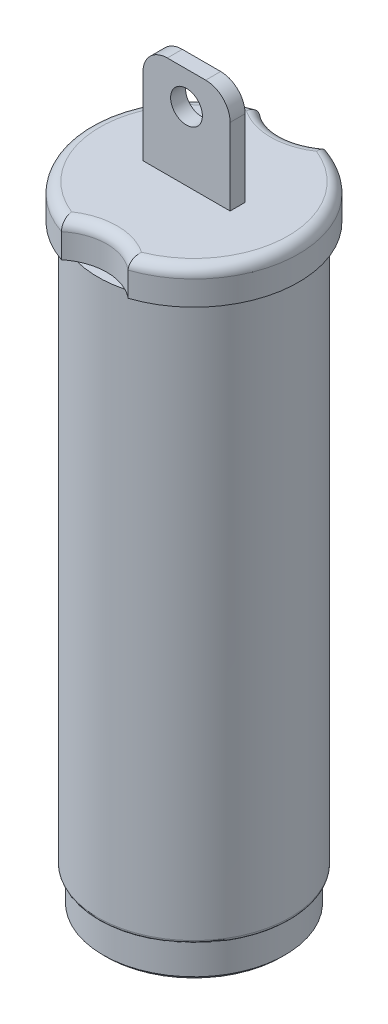
ISO-10303-21;
HEADER;
FILE_DESCRIPTION(('STEP AP214'),'2;1');
FILE_NAME('part.step','',(''),(''),'','','');
FILE_SCHEMA(('AUTOMOTIVE_DESIGN { 1 0 10303 214 1 1 1 1 }'));
ENDSEC;
DATA;
#1=APPLICATION_CONTEXT('core data for automotive mechanical design processes');
#2=APPLICATION_PROTOCOL_DEFINITION('international standard','automotive_design',2000,#1);
#3=PRODUCT_CONTEXT('',#1,'mechanical');
#4=PRODUCT('Part','Part','',(#3));
#5=PRODUCT_RELATED_PRODUCT_CATEGORY('part','',(#4));
#6=PRODUCT_DEFINITION_FORMATION('','',#4);
#7=PRODUCT_DEFINITION_CONTEXT('part definition',#1,'design');
#8=PRODUCT_DEFINITION('design','',#6,#7);
#9=PRODUCT_DEFINITION_SHAPE('','',#8);
#10=(LENGTH_UNIT() NAMED_UNIT(*) SI_UNIT(.MILLI.,.METRE.));
#11=(NAMED_UNIT(*) PLANE_ANGLE_UNIT() SI_UNIT($,.RADIAN.));
#12=(NAMED_UNIT(*) SI_UNIT($,.STERADIAN.) SOLID_ANGLE_UNIT());
#13=UNCERTAINTY_MEASURE_WITH_UNIT(LENGTH_MEASURE(1.E-05),#10,'distance_accuracy_value','');
#14=(GEOMETRIC_REPRESENTATION_CONTEXT(3) GLOBAL_UNCERTAINTY_ASSIGNED_CONTEXT((#13)) GLOBAL_UNIT_ASSIGNED_CONTEXT((#10,
#11,#12)) REPRESENTATION_CONTEXT('',''));
#15=CARTESIAN_POINT('',(0.,0.,0.));
#16=DIRECTION('',(0.,0.,1.));
#17=DIRECTION('',(1.,0.,0.));
#18=AXIS2_PLACEMENT_3D('',#15,#16,#17);
#19=CARTESIAN_POINT('',(0.,17.,0.));
#20=DIRECTION('',(0.,1.,0.));
#21=DIRECTION('',(0.,0.,1.));
#22=AXIS2_PLACEMENT_3D('',#19,#20,#21);
#23=PLANE('',#22);
#24=CARTESIAN_POINT('',(0.,17.,0.));
#25=DIRECTION('',(0.,1.,0.));
#26=DIRECTION('',(0.,0.,1.));
#27=AXIS2_PLACEMENT_3D('',#24,#25,#26);
#28=CIRCLE('',#27,2.7);
#29=CARTESIAN_POINT('',(-1.00434602478429,17.,-2.50625));
#30=VERTEX_POINT('',#29);
#31=CARTESIAN_POINT('',(-1.00434602478429,17.,2.50625));
#32=VERTEX_POINT('',#31);
#33=EDGE_CURVE('E271',#30,#32,#28,.T.);
#34=ORIENTED_EDGE('',*,*,#33,.T.);
#35=CARTESIAN_POINT('',(0.,17.,4.));
#36=DIRECTION('',(0.,1.,0.));
#37=DIRECTION('',(0.,0.,1.));
#38=AXIS2_PLACEMENT_3D('',#35,#36,#37);
#39=CIRCLE('',#38,1.8);
#40=CARTESIAN_POINT('',(1.00434602478429,17.,2.50625));
#41=VERTEX_POINT('',#40);
#42=EDGE_CURVE('E273',#32,#41,#39,.F.);
#43=ORIENTED_EDGE('',*,*,#42,.T.);
#44=CARTESIAN_POINT('',(0.,17.,0.));
#45=DIRECTION('',(0.,1.,0.));
#46=DIRECTION('',(0.,0.,1.));
#47=AXIS2_PLACEMENT_3D('',#44,#45,#46);
#48=CIRCLE('',#47,2.7);
#49=CARTESIAN_POINT('',(1.00434602478429,17.,-2.50625));
#50=VERTEX_POINT('',#49);
#51=EDGE_CURVE('E267',#41,#50,#48,.T.);
#52=ORIENTED_EDGE('',*,*,#51,.T.);
#53=CARTESIAN_POINT('',(0.,17.,-4.));
#54=DIRECTION('',(0.,1.,0.));
#55=DIRECTION('',(0.,0.,1.));
#56=AXIS2_PLACEMENT_3D('',#53,#54,#55);
#57=CIRCLE('',#56,1.8);
#58=EDGE_CURVE('E269',#50,#30,#57,.F.);
#59=ORIENTED_EDGE('',*,*,#58,.T.);
#60=EDGE_LOOP('',(#34,#43,#52,#59));
#61=FACE_BOUND('',#60,.T.);
#62=DIRECTION('',(1.,0.,0.));
#63=VECTOR('',#62,1.);
#64=CARTESIAN_POINT('',(1.25,17.,0.214689537244794));
#65=LINE('',#64,#63);
#66=CARTESIAN_POINT('',(-1.25,17.,0.214689537244794));
#67=VERTEX_POINT('',#66);
#68=CARTESIAN_POINT('',(1.25,17.,0.214689537244794));
#69=VERTEX_POINT('',#68);
#70=EDGE_CURVE('E146',#67,#69,#65,.T.);
#71=ORIENTED_EDGE('',*,*,#70,.F.);
#72=DIRECTION('',(0.,0.,1.));
#73=VECTOR('',#72,1.);
#74=CARTESIAN_POINT('',(-1.25,17.,0.214689537244794));
#75=LINE('',#74,#73);
#76=CARTESIAN_POINT('',(-1.25,17.,-0.214689537244794));
#77=VERTEX_POINT('',#76);
#78=EDGE_CURVE('E153',#77,#67,#75,.T.);
#79=ORIENTED_EDGE('',*,*,#78,.F.);
#80=DIRECTION('',(-1.,0.,0.));
#81=VECTOR('',#80,1.);
#82=CARTESIAN_POINT('',(1.25,17.,-0.214689537244795));
#83=LINE('',#82,#81);
#84=CARTESIAN_POINT('',(1.25,17.,-0.214689537244795));
#85=VERTEX_POINT('',#84);
#86=EDGE_CURVE('E164',#85,#77,#83,.T.);
#87=ORIENTED_EDGE('',*,*,#86,.F.);
#88=DIRECTION('',(0.,0.,-1.));
#89=VECTOR('',#88,1.);
#90=CARTESIAN_POINT('',(1.25,17.,0.214689537244794));
#91=LINE('',#90,#89);
#92=EDGE_CURVE('E162',#69,#85,#91,.T.);
#93=ORIENTED_EDGE('',*,*,#92,.F.);
#94=EDGE_LOOP('',(#71,#79,#87,#93));
#95=FACE_BOUND('',#94,.T.);
#96=ADVANCED_FACE('F39',(#61,#95),#23,.T.);
#97=CARTESIAN_POINT('',(0.,16.,0.));
#98=DIRECTION('',(0.,1.,0.));
#99=DIRECTION('',(0.,0.,1.));
#100=AXIS2_PLACEMENT_3D('',#97,#98,#99);
#101=PLANE('',#100);
#102=CARTESIAN_POINT('',(0.,16.,0.));
#103=DIRECTION('',(0.,1.,0.));
#104=DIRECTION('',(0.,0.,1.));
#105=AXIS2_PLACEMENT_3D('',#102,#103,#104);
#106=CIRCLE('',#105,2.75);
#107=CARTESIAN_POINT('',(0.68210775988384,16.,-2.6640625));
#108=VERTEX_POINT('',#107);
#109=CARTESIAN_POINT('',(-0.68210775988384,16.,-2.6640625));
#110=VERTEX_POINT('',#109);
#111=EDGE_CURVE('E463',#108,#110,#106,.T.);
#112=ORIENTED_EDGE('',*,*,#111,.T.);
#113=CARTESIAN_POINT('',(0.,16.,-4.));
#114=DIRECTION('',(0.,1.,0.));
#115=DIRECTION('',(0.,0.,1.));
#116=AXIS2_PLACEMENT_3D('',#113,#114,#115);
#117=CIRCLE('',#116,1.5);
#118=EDGE_CURVE('E184',#110,#108,#117,.T.);
#119=ORIENTED_EDGE('',*,*,#118,.T.);
#120=EDGE_LOOP('',(#112,#119));
#121=FACE_BOUND('',#120,.T.);
#122=ADVANCED_FACE('F339',(#121),#101,.T.);
#123=CARTESIAN_POINT('',(0.,16.,4.));
#124=DIRECTION('',(0.,1.,0.));
#125=DIRECTION('',(0.,0.,1.));
#126=AXIS2_PLACEMENT_3D('',#123,#124,#125);
#127=CIRCLE('',#126,1.5);
#128=CARTESIAN_POINT('',(-0.68210775988384,16.,2.6640625));
#129=VERTEX_POINT('',#128);
#130=CARTESIAN_POINT('',(0.68210775988384,16.,2.6640625));
#131=VERTEX_POINT('',#130);
#132=EDGE_CURVE('E192',#129,#131,#127,.F.);
#133=ORIENTED_EDGE('',*,*,#132,.F.);
#134=EDGE_CURVE('E461',#129,#131,#106,.T.);
#135=ORIENTED_EDGE('',*,*,#134,.T.);
#136=EDGE_LOOP('',(#133,#135));
#137=FACE_BOUND('',#136,.T.);
#138=ADVANCED_FACE('F244',(#137),#101,.T.);
#139=CARTESIAN_POINT('',(0.,0.,0.));
#140=DIRECTION('',(0.,1.,0.));
#141=DIRECTION('',(0.,0.,1.));
#142=AXIS2_PLACEMENT_3D('',#139,#140,#141);
#143=PLANE('',#142);
#144=CARTESIAN_POINT('',(0.,0.,0.));
#145=DIRECTION('',(0.,1.,0.));
#146=DIRECTION('',(0.,0.,1.));
#147=AXIS2_PLACEMENT_3D('',#144,#145,#146);
#148=CIRCLE('',#147,2.65);
#149=CARTESIAN_POINT('',(0.,0.,2.65));
#150=VERTEX_POINT('',#149);
#151=EDGE_CURVE('E11',#150,#150,#148,.F.);
#152=ORIENTED_EDGE('',*,*,#151,.T.);
#153=EDGE_LOOP('',(#152));
#154=FACE_BOUND('',#153,.T.);
#155=CARTESIAN_POINT('',(0.,0.,0.));
#156=DIRECTION('',(0.,-1.,0.));
#157=DIRECTION('',(0.,0.,-1.));
#158=AXIS2_PLACEMENT_3D('',#155,#156,#157);
#159=CIRCLE('',#158,2.60763051780912);
#160=CARTESIAN_POINT('',(0.,0.,-2.60763051780912));
#161=VERTEX_POINT('',#160);
#162=EDGE_CURVE('E201',#161,#161,#159,.T.);
#163=ORIENTED_EDGE('',*,*,#162,.F.);
#164=EDGE_LOOP('',(#163));
#165=FACE_BOUND('',#164,.T.);
#166=ADVANCED_FACE('F453',(#154,#165),#143,.F.);
#167=CARTESIAN_POINT('',(0.,16.,0.));
#168=DIRECTION('',(0.,-1.,0.));
#169=DIRECTION('',(0.,0.,-1.));
#170=AXIS2_PLACEMENT_3D('',#167,#168,#169);
#171=CYLINDRICAL_SURFACE('',#170,2.75);
#172=CARTESIAN_POINT('',(0.,0.0999999999999994,0.));
#173=DIRECTION('',(0.,1.,0.));
#174=DIRECTION('',(0.,0.,1.));
#175=AXIS2_PLACEMENT_3D('',#172,#173,#174);
#176=CIRCLE('',#175,2.75);
#177=CARTESIAN_POINT('',(0.,0.0999999999999994,2.75));
#178=VERTEX_POINT('',#177);
#179=EDGE_CURVE('E47',#178,#178,#176,.T.);
#180=ORIENTED_EDGE('',*,*,#179,.T.);
#181=EDGE_LOOP('',(#180));
#182=FACE_BOUND('',#181,.T.);
#183=EDGE_CURVE('E205',#131,#108,#106,.T.);
#184=ORIENTED_EDGE('',*,*,#183,.F.);
#185=ORIENTED_EDGE('',*,*,#134,.F.);
#186=EDGE_CURVE('E467',#110,#129,#106,.T.);
#187=ORIENTED_EDGE('',*,*,#186,.F.);
#188=ORIENTED_EDGE('',*,*,#111,.F.);
#189=EDGE_LOOP('',(#184,#185,#187,#188));
#190=FACE_BOUND('',#189,.T.);
#191=ADVANCED_FACE('F242',(#182,#190),#171,.T.);
#192=CARTESIAN_POINT('',(0.,16.,0.));
#193=DIRECTION('',(0.,-1.,0.));
#194=DIRECTION('',(0.,0.,-1.));
#195=AXIS2_PLACEMENT_3D('',#192,#193,#194);
#196=CYLINDRICAL_SURFACE('',#195,1.05);
#197=CARTESIAN_POINT('',(0.,16.,0.));
#198=DIRECTION('',(0.,1.,0.));
#199=DIRECTION('',(0.,0.,1.));
#200=AXIS2_PLACEMENT_3D('',#197,#198,#199);
#201=CIRCLE('',#200,1.05);
#202=CARTESIAN_POINT('',(0.,16.,1.05));
#203=VERTEX_POINT('',#202);
#204=EDGE_CURVE('E200',#203,#203,#201,.T.);
#205=ORIENTED_EDGE('',*,*,#204,.T.);
#206=EDGE_LOOP('',(#205));
#207=FACE_BOUND('',#206,.T.);
#208=CARTESIAN_POINT('',(0.,0.,0.));
#209=DIRECTION('',(0.,1.,0.));
#210=DIRECTION('',(0.,0.,-1.));
#211=AXIS2_PLACEMENT_3D('',#208,#209,#210);
#212=CIRCLE('',#211,1.045);
#213=CARTESIAN_POINT('',(0.,0.,-1.045));
#214=VERTEX_POINT('',#213);
#215=EDGE_CURVE('E210',#214,#214,#212,.T.);
#216=ORIENTED_EDGE('',*,*,#215,.F.);
#217=EDGE_LOOP('',(#216));
#218=FACE_BOUND('',#217,.T.);
#219=ADVANCED_FACE('F234',(#207,#218),#196,.F.);
#220=CARTESIAN_POINT('',(0.,-1.,0.));
#221=DIRECTION('',(0.,-1.,0.));
#222=DIRECTION('',(0.,0.,-1.));
#223=AXIS2_PLACEMENT_3D('',#220,#221,#222);
#224=PLANE('',#223);
#225=CARTESIAN_POINT('',(0.,-1.,0.));
#226=DIRECTION('',(0.,-1.,0.));
#227=DIRECTION('',(0.,0.,-1.));
#228=AXIS2_PLACEMENT_3D('',#225,#226,#227);
#229=CIRCLE('',#228,2.50763051780912);
#230=CARTESIAN_POINT('',(0.,-1.,-2.50763051780912));
#231=VERTEX_POINT('',#230);
#232=EDGE_CURVE('E261',#231,#231,#229,.T.);
#233=ORIENTED_EDGE('',*,*,#232,.T.);
#234=EDGE_LOOP('',(#233));
#235=FACE_BOUND('',#234,.T.);
#236=CARTESIAN_POINT('',(0.,-1.,0.));
#237=DIRECTION('',(0.,-1.,0.));
#238=DIRECTION('',(0.,0.,-1.));
#239=AXIS2_PLACEMENT_3D('',#236,#237,#238);
#240=CIRCLE('',#239,1.845);
#241=CARTESIAN_POINT('',(0.,-1.,-1.845));
#242=VERTEX_POINT('',#241);
#243=EDGE_CURVE('E258',#242,#242,#240,.F.);
#244=ORIENTED_EDGE('',*,*,#243,.T.);
#245=EDGE_LOOP('',(#244));
#246=FACE_BOUND('',#245,.T.);
#247=ADVANCED_FACE('F231',(#235,#246),#224,.T.);
#248=CARTESIAN_POINT('',(0.,-1.,0.));
#249=DIRECTION('',(0.,1.,0.));
#250=DIRECTION('',(0.,0.,1.));
#251=AXIS2_PLACEMENT_3D('',#248,#249,#250);
#252=CYLINDRICAL_SURFACE('',#251,2.60763051780912);
#253=CARTESIAN_POINT('',(0.,-0.899999999999997,0.));
#254=DIRECTION('',(0.,-1.,0.));
#255=DIRECTION('',(0.,0.,-1.));
#256=AXIS2_PLACEMENT_3D('',#253,#254,#255);
#257=CIRCLE('',#256,2.60763051780912);
#258=CARTESIAN_POINT('',(0.,-0.899999999999997,-2.60763051780912));
#259=VERTEX_POINT('',#258);
#260=EDGE_CURVE('E264',#259,#259,#257,.F.);
#261=ORIENTED_EDGE('',*,*,#260,.T.);
#262=EDGE_LOOP('',(#261));
#263=FACE_BOUND('',#262,.T.);
#264=ORIENTED_EDGE('',*,*,#162,.T.);
#265=EDGE_LOOP('',(#264));
#266=FACE_BOUND('',#265,.T.);
#267=ADVANCED_FACE('F227',(#263,#266),#252,.T.);
#268=CARTESIAN_POINT('',(0.,-1.,0.));
#269=DIRECTION('',(0.,1.,0.));
#270=DIRECTION('',(0.,0.,1.));
#271=AXIS2_PLACEMENT_3D('',#268,#269,#270);
#272=CYLINDRICAL_SURFACE('',#271,1.045);
#273=CARTESIAN_POINT('',(0.,-0.199999999999999,0.));
#274=DIRECTION('',(0.,-1.,0.));
#275=DIRECTION('',(0.,0.,-1.));
#276=AXIS2_PLACEMENT_3D('',#273,#274,#275);
#277=CIRCLE('',#276,1.045);
#278=CARTESIAN_POINT('',(0.,-0.199999999999999,-1.045));
#279=VERTEX_POINT('',#278);
#280=EDGE_CURVE('E204',#279,#279,#277,.T.);
#281=ORIENTED_EDGE('',*,*,#280,.T.);
#282=EDGE_LOOP('',(#281));
#283=FACE_BOUND('',#282,.T.);
#284=ORIENTED_EDGE('',*,*,#215,.T.);
#285=EDGE_LOOP('',(#284));
#286=FACE_BOUND('',#285,.T.);
#287=ADVANCED_FACE('F216',(#283,#286),#272,.F.);
#288=CARTESIAN_POINT('',(0.,-0.199999999999999,0.));
#289=DIRECTION('',(0.,-1.,0.));
#290=DIRECTION('',(0.,0.,-1.));
#291=AXIS2_PLACEMENT_3D('',#288,#289,#290);
#292=CONICAL_SURFACE('',#291,1.045,0.78539816339745);
#293=ORIENTED_EDGE('',*,*,#243,.F.);
#294=EDGE_LOOP('',(#293));
#295=FACE_BOUND('',#294,.T.);
#296=ORIENTED_EDGE('',*,*,#280,.F.);
#297=EDGE_LOOP('',(#296));
#298=FACE_BOUND('',#297,.T.);
#299=ADVANCED_FACE('F226',(#295,#298),#292,.F.);
#300=CARTESIAN_POINT('',(0.,-1.,0.));
#301=DIRECTION('',(0.,1.,0.));
#302=DIRECTION('',(0.,0.,1.));
#303=AXIS2_PLACEMENT_3D('',#300,#301,#302);
#304=CONICAL_SURFACE('',#303,2.50763051780912,0.78539816339744);
#305=ORIENTED_EDGE('',*,*,#260,.F.);
#306=EDGE_LOOP('',(#305));
#307=FACE_BOUND('',#306,.T.);
#308=ORIENTED_EDGE('',*,*,#232,.F.);
#309=EDGE_LOOP('',(#308));
#310=FACE_BOUND('',#309,.T.);
#311=ADVANCED_FACE('F358',(#307,#310),#304,.T.);
#312=CARTESIAN_POINT('',(0.,17.,4.));
#313=DIRECTION('',(0.,-1.,0.));
#314=DIRECTION('',(0.,0.,-1.));
#315=AXIS2_PLACEMENT_3D('',#312,#313,#314);
#316=CYLINDRICAL_SURFACE('',#315,1.5);
#317=DIRECTION('',(0.,-1.,0.));
#318=VECTOR('',#317,1.);
#319=CARTESIAN_POINT('',(0.955555303213792,17.,2.84375));
#320=LINE('',#319,#318);
#321=CARTESIAN_POINT('',(0.955555303213792,16.7,2.84375));
#322=VERTEX_POINT('',#321);
#323=CARTESIAN_POINT('',(0.955555303213792,16.,2.84375));
#324=VERTEX_POINT('',#323);
#325=EDGE_CURVE('E191',#322,#324,#320,.T.);
#326=ORIENTED_EDGE('',*,*,#325,.F.);
#327=CARTESIAN_POINT('',(0.,16.7,4.));
#328=DIRECTION('',(0.,1.,0.));
#329=DIRECTION('',(0.,0.,1.));
#330=AXIS2_PLACEMENT_3D('',#327,#328,#329);
#331=CIRCLE('',#330,1.5);
#332=CARTESIAN_POINT('',(-0.955555303213792,16.7,2.84375));
#333=VERTEX_POINT('',#332);
#334=EDGE_CURVE('E276',#322,#333,#331,.T.);
#335=ORIENTED_EDGE('',*,*,#334,.T.);
#336=DIRECTION('',(0.,-1.,0.));
#337=VECTOR('',#336,1.);
#338=CARTESIAN_POINT('',(-0.955555303213792,17.,2.84375));
#339=LINE('',#338,#337);
#340=CARTESIAN_POINT('',(-0.955555303213792,16.,2.84375));
#341=VERTEX_POINT('',#340);
#342=EDGE_CURVE('E194',#333,#341,#339,.T.);
#343=ORIENTED_EDGE('',*,*,#342,.T.);
#344=EDGE_CURVE('E188',#341,#129,#127,.F.);
#345=ORIENTED_EDGE('',*,*,#344,.T.);
#346=ORIENTED_EDGE('',*,*,#132,.T.);
#347=EDGE_CURVE('E187',#131,#324,#127,.F.);
#348=ORIENTED_EDGE('',*,*,#347,.T.);
#349=EDGE_LOOP('',(#326,#335,#343,#345,#346,#348));
#350=FACE_BOUND('',#349,.T.);
#351=ADVANCED_FACE('F354',(#350),#316,.F.);
#352=CARTESIAN_POINT('',(0.,17.,0.));
#353=DIRECTION('',(0.,-1.,0.));
#354=DIRECTION('',(0.,0.,-1.));
#355=AXIS2_PLACEMENT_3D('',#352,#353,#354);
#356=CYLINDRICAL_SURFACE('',#355,3.);
#357=ORIENTED_EDGE('',*,*,#342,.F.);
#358=CARTESIAN_POINT('',(0.,16.7,0.));
#359=DIRECTION('',(0.,1.,0.));
#360=DIRECTION('',(0.,0.,1.));
#361=AXIS2_PLACEMENT_3D('',#358,#359,#360);
#362=CIRCLE('',#361,3.);
#363=CARTESIAN_POINT('',(-0.955555303213792,16.7,-2.84375));
#364=VERTEX_POINT('',#363);
#365=EDGE_CURVE('E279',#333,#364,#362,.F.);
#366=ORIENTED_EDGE('',*,*,#365,.T.);
#367=DIRECTION('',(0.,-1.,0.));
#368=VECTOR('',#367,1.);
#369=CARTESIAN_POINT('',(-0.955555303213792,17.,-2.84375));
#370=LINE('',#369,#368);
#371=CARTESIAN_POINT('',(-0.955555303213792,16.,-2.84375));
#372=VERTEX_POINT('',#371);
#373=EDGE_CURVE('E196',#364,#372,#370,.T.);
#374=ORIENTED_EDGE('',*,*,#373,.T.);
#375=CARTESIAN_POINT('',(0.,16.,0.));
#376=DIRECTION('',(0.,1.,0.));
#377=DIRECTION('',(0.,0.,1.));
#378=AXIS2_PLACEMENT_3D('',#375,#376,#377);
#379=CIRCLE('',#378,3.);
#380=EDGE_CURVE('E183',#372,#341,#379,.T.);
#381=ORIENTED_EDGE('',*,*,#380,.T.);
#382=EDGE_LOOP('',(#357,#366,#374,#381));
#383=FACE_BOUND('',#382,.T.);
#384=ADVANCED_FACE('F357',(#383),#356,.T.);
#385=CARTESIAN_POINT('',(0.,17.,-4.));
#386=DIRECTION('',(0.,-1.,0.));
#387=DIRECTION('',(0.,0.,-1.));
#388=AXIS2_PLACEMENT_3D('',#385,#386,#387);
#389=CYLINDRICAL_SURFACE('',#388,1.5);
#390=ORIENTED_EDGE('',*,*,#373,.F.);
#391=CARTESIAN_POINT('',(0.,16.7,-4.));
#392=DIRECTION('',(0.,1.,0.));
#393=DIRECTION('',(0.,0.,1.));
#394=AXIS2_PLACEMENT_3D('',#391,#392,#393);
#395=CIRCLE('',#394,1.5);
#396=CARTESIAN_POINT('',(0.955555303213792,16.7,-2.84375));
#397=VERTEX_POINT('',#396);
#398=EDGE_CURVE('E281',#364,#397,#395,.T.);
#399=ORIENTED_EDGE('',*,*,#398,.T.);
#400=DIRECTION('',(0.,-1.,0.));
#401=VECTOR('',#400,1.);
#402=CARTESIAN_POINT('',(0.955555303213792,17.,-2.84375));
#403=LINE('',#402,#401);
#404=CARTESIAN_POINT('',(0.955555303213792,16.,-2.84375));
#405=VERTEX_POINT('',#404);
#406=EDGE_CURVE('E198',#397,#405,#403,.T.);
#407=ORIENTED_EDGE('',*,*,#406,.T.);
#408=EDGE_CURVE('E178',#108,#405,#117,.T.);
#409=ORIENTED_EDGE('',*,*,#408,.F.);
#410=ORIENTED_EDGE('',*,*,#118,.F.);
#411=EDGE_CURVE('E180',#372,#110,#117,.T.);
#412=ORIENTED_EDGE('',*,*,#411,.F.);
#413=EDGE_LOOP('',(#390,#399,#407,#409,#410,#412));
#414=FACE_BOUND('',#413,.T.);
#415=ADVANCED_FACE('F361',(#414),#389,.F.);
#416=CARTESIAN_POINT('',(0.,17.,0.));
#417=DIRECTION('',(0.,-1.,0.));
#418=DIRECTION('',(0.,0.,-1.));
#419=AXIS2_PLACEMENT_3D('',#416,#417,#418);
#420=CYLINDRICAL_SURFACE('',#419,3.);
#421=ORIENTED_EDGE('',*,*,#406,.F.);
#422=CARTESIAN_POINT('',(0.,16.7,0.));
#423=DIRECTION('',(0.,1.,0.));
#424=DIRECTION('',(0.,0.,1.));
#425=AXIS2_PLACEMENT_3D('',#422,#423,#424);
#426=CIRCLE('',#425,3.);
#427=EDGE_CURVE('E283',#397,#322,#426,.F.);
#428=ORIENTED_EDGE('',*,*,#427,.T.);
#429=ORIENTED_EDGE('',*,*,#325,.T.);
#430=CARTESIAN_POINT('',(0.,16.,0.));
#431=DIRECTION('',(0.,1.,0.));
#432=DIRECTION('',(0.,0.,1.));
#433=AXIS2_PLACEMENT_3D('',#430,#431,#432);
#434=CIRCLE('',#433,3.);
#435=EDGE_CURVE('E175',#324,#405,#434,.T.);
#436=ORIENTED_EDGE('',*,*,#435,.T.);
#437=EDGE_LOOP('',(#421,#428,#429,#436));
#438=FACE_BOUND('',#437,.T.);
#439=ADVANCED_FACE('F229',(#438),#420,.T.);
#440=CARTESIAN_POINT('',(0.,16.,0.));
#441=DIRECTION('',(0.,1.,0.));
#442=DIRECTION('',(0.,0.,1.));
#443=AXIS2_PLACEMENT_3D('',#440,#441,#442);
#444=PLANE('',#443);
#445=ORIENTED_EDGE('',*,*,#411,.T.);
#446=ORIENTED_EDGE('',*,*,#186,.T.);
#447=ORIENTED_EDGE('',*,*,#344,.F.);
#448=ORIENTED_EDGE('',*,*,#380,.F.);
#449=EDGE_LOOP('',(#445,#446,#447,#448));
#450=FACE_BOUND('',#449,.T.);
#451=ADVANCED_FACE('F353',(#450),#444,.F.);
#452=ORIENTED_EDGE('',*,*,#347,.F.);
#453=ORIENTED_EDGE('',*,*,#183,.T.);
#454=ORIENTED_EDGE('',*,*,#408,.T.);
#455=ORIENTED_EDGE('',*,*,#435,.F.);
#456=EDGE_LOOP('',(#452,#453,#454,#455));
#457=FACE_BOUND('',#456,.T.);
#458=ADVANCED_FACE('F351',(#457),#444,.F.);
#459=ORIENTED_EDGE('',*,*,#204,.F.);
#460=EDGE_LOOP('',(#459));
#461=FACE_BOUND('',#460,.T.);
#462=ADVANCED_FACE('F323',(#461),#444,.F.);
#463=CARTESIAN_POINT('',(0.,16.7,-4.));
#464=DIRECTION('',(0.,1.,0.));
#465=DIRECTION('',(0.,0.,1.));
#466=AXIS2_PLACEMENT_3D('',#463,#464,#465);
#467=TOROIDAL_SURFACE('',#466,1.8,0.3);
#468=CARTESIAN_POINT('',(0.955555303213792,16.7,-2.84375));
#469=CARTESIAN_POINT('',(0.955548701487983,16.715384339661,-2.84377207727176));
#470=CARTESIAN_POINT('',(0.95580174054099,16.730751513169,-2.84242028339868));
#471=CARTESIAN_POINT('',(0.956774776183254,16.7609597229585,-2.83714787720674));
#472=CARTESIAN_POINT('',(0.957492811320862,16.7758026943546,-2.83323805448418));
#473=CARTESIAN_POINT('',(0.959343535658604,16.8045947766047,-2.82303011059292));
#474=CARTESIAN_POINT('',(0.960475878296952,16.8185446231176,-2.81673398537173));
#475=CARTESIAN_POINT('',(0.963073607038979,16.8452523125629,-2.8020263924885));
#476=CARTESIAN_POINT('',(0.964539259371533,16.8580091910625,-2.79361323328459));
#477=CARTESIAN_POINT('',(0.96779448281328,16.8826943382473,-2.77450655708168));
#478=CARTESIAN_POINT('',(0.969596689853157,16.8945480383382,-2.76371920903136));
#479=CARTESIAN_POINT('',(0.973368124994136,16.9164889011527,-2.74050828464685));
#480=CARTESIAN_POINT('',(0.975337400111097,16.9265755641372,-2.72808424717244));
#481=CARTESIAN_POINT('',(0.979590034044766,16.9459564541,-2.70038676711626));
#482=CARTESIAN_POINT('',(0.981882962794164,16.9550152228182,-2.68495012894321));
#483=CARTESIAN_POINT('',(0.986458193334012,16.9706987304564,-2.65287691843595));
#484=CARTESIAN_POINT('',(0.988740484500178,16.9773214049212,-2.63623934258911));
#485=CARTESIAN_POINT('',(0.993286535694899,16.9882657945014,-2.60157388148209));
#486=CARTESIAN_POINT('',(0.995546845241936,16.9924987689439,-2.58351770874323));
#487=CARTESIAN_POINT('',(0.999890275795183,16.9982613247151,-2.54698677070024));
#488=CARTESIAN_POINT('',(1.00197375919003,16.9997965686764,-2.5285129648368));
#489=CARTESIAN_POINT('',(1.00407829330572,16.9999937106008,-2.50877584257417));
#490=CARTESIAN_POINT('',(1.00421242895935,17.000000012848,-2.50751288583825));
#491=CARTESIAN_POINT('',(1.00434602478429,17.,-2.50625));
#492=B_SPLINE_CURVE_WITH_KNOTS('',3,(#468,#469,#470,#471,#472,#473,#474,#475,#476,#477,#478,
#479,#480,#481,#482,#483,#484,#485,#486,#487,#488,#489,#490,#491),.UNSPECIFIED.,.F.,.F.,(4,2,2,
2,2,2,2,2,2,2,2,4),(0.,0.0460647228614722,0.0919363896364907,0.137769772872144,
0.183639894602704,0.231830584299086,0.280034880966539,0.333950101679263,0.387910907871495,
0.443762183138881,0.49949608391235,0.503306237325868),.UNSPECIFIED.);
#493=EDGE_CURVE('E309',#397,#50,#492,.T.);
#494=ORIENTED_EDGE('',*,*,#493,.F.);
#495=ORIENTED_EDGE('',*,*,#398,.F.);
#496=CARTESIAN_POINT('',(-0.955555303213792,16.7,-2.84375));
#497=CARTESIAN_POINT('',(-0.955548701487983,16.715384339661,-2.84377207727176));
#498=CARTESIAN_POINT('',(-0.95580174054099,16.730751513169,-2.84242028339868));
#499=CARTESIAN_POINT('',(-0.956774776183254,16.7609597229585,-2.83714787720674));
#500=CARTESIAN_POINT('',(-0.957492811320862,16.7758026943546,-2.83323805448418));
#501=CARTESIAN_POINT('',(-0.959343535658604,16.8045947766047,-2.82303011059292));
#502=CARTESIAN_POINT('',(-0.960475878296952,16.8185446231176,-2.81673398537173));
#503=CARTESIAN_POINT('',(-0.963073607038979,16.8452523125629,-2.8020263924885));
#504=CARTESIAN_POINT('',(-0.964539259371533,16.8580091910625,-2.79361323328459));
#505=CARTESIAN_POINT('',(-0.96779448281328,16.8826943382473,-2.77450655708168));
#506=CARTESIAN_POINT('',(-0.969596689853157,16.8945480383382,-2.76371920903136));
#507=CARTESIAN_POINT('',(-0.973368124994136,16.9164889011527,-2.74050828464685));
#508=CARTESIAN_POINT('',(-0.975337400111097,16.9265755641372,-2.72808424717244));
#509=CARTESIAN_POINT('',(-0.979590034044766,16.9459564541,-2.70038676711626));
#510=CARTESIAN_POINT('',(-0.981882962794164,16.9550152228182,-2.68495012894321));
#511=CARTESIAN_POINT('',(-0.986458193334012,16.9706987304564,-2.65287691843595));
#512=CARTESIAN_POINT('',(-0.988740484500178,16.9773214049212,-2.63623934258911));
#513=CARTESIAN_POINT('',(-0.993286535694899,16.9882657945014,-2.60157388148209));
#514=CARTESIAN_POINT('',(-0.995546845241936,16.9924987689439,-2.58351770874323));
#515=CARTESIAN_POINT('',(-0.999890275795183,16.9982613247151,-2.54698677070024));
#516=CARTESIAN_POINT('',(-1.00197375919003,16.9997965686764,-2.5285129648368));
#517=CARTESIAN_POINT('',(-1.00407829330572,16.9999937106008,-2.50877584257417));
#518=CARTESIAN_POINT('',(-1.00421242895935,17.000000012848,-2.50751288583825));
#519=CARTESIAN_POINT('',(-1.00434602478429,17.,-2.50625));
#520=B_SPLINE_CURVE_WITH_KNOTS('',3,(#496,#497,#498,#499,#500,#501,#502,#503,#504,#505,#506,
#507,#508,#509,#510,#511,#512,#513,#514,#515,#516,#517,#518,#519),.UNSPECIFIED.,.F.,.F.,(4,2,2,
2,2,2,2,2,2,2,2,4),(0.,0.0460647228614722,0.0919363896364907,0.137769772872144,
0.183639894602704,0.231830584299086,0.280034880966539,0.333950101679263,0.387910907871495,
0.443762183138881,0.49949608391235,0.503306237325868),.UNSPECIFIED.);
#521=EDGE_CURVE('E179',#30,#364,#520,.F.);
#522=ORIENTED_EDGE('',*,*,#521,.F.);
#523=ORIENTED_EDGE('',*,*,#58,.F.);
#524=EDGE_LOOP('',(#494,#495,#522,#523));
#525=FACE_BOUND('',#524,.T.);
#526=ADVANCED_FACE('F319',(#525),#467,.T.);
#527=CARTESIAN_POINT('',(0.,16.7,0.));
#528=DIRECTION('',(0.,1.,0.));
#529=DIRECTION('',(0.,0.,1.));
#530=AXIS2_PLACEMENT_3D('',#527,#528,#529);
#531=TOROIDAL_SURFACE('',#530,2.7,0.3);
#532=ORIENTED_EDGE('',*,*,#521,.T.);
#533=ORIENTED_EDGE('',*,*,#365,.F.);
#534=CARTESIAN_POINT('',(-0.955555303213792,16.7,2.84375));
#535=CARTESIAN_POINT('',(-0.955548701487983,16.715384339661,2.84377207727176));
#536=CARTESIAN_POINT('',(-0.95580174054099,16.730751513169,2.84242028339868));
#537=CARTESIAN_POINT('',(-0.956774776183254,16.7609597229585,2.83714787720674));
#538=CARTESIAN_POINT('',(-0.957492811320862,16.7758026943546,2.83323805448418));
#539=CARTESIAN_POINT('',(-0.959343535658604,16.8045947766047,2.82303011059292));
#540=CARTESIAN_POINT('',(-0.960475878296952,16.8185446231176,2.81673398537173));
#541=CARTESIAN_POINT('',(-0.963073607038979,16.8452523125629,2.8020263924885));
#542=CARTESIAN_POINT('',(-0.964539259371533,16.8580091910625,2.79361323328459));
#543=CARTESIAN_POINT('',(-0.96779448281328,16.8826943382473,2.77450655708168));
#544=CARTESIAN_POINT('',(-0.969596689853157,16.8945480383382,2.76371920903136));
#545=CARTESIAN_POINT('',(-0.973368124994136,16.9164889011527,2.74050828464685));
#546=CARTESIAN_POINT('',(-0.975337400111097,16.9265755641372,2.72808424717244));
#547=CARTESIAN_POINT('',(-0.979590034044766,16.9459564541,2.70038676711626));
#548=CARTESIAN_POINT('',(-0.981882962794164,16.9550152228182,2.68495012894321));
#549=CARTESIAN_POINT('',(-0.986458193334012,16.9706987304564,2.65287691843595));
#550=CARTESIAN_POINT('',(-0.988740484500178,16.9773214049212,2.63623934258911));
#551=CARTESIAN_POINT('',(-0.993286535694899,16.9882657945014,2.60157388148209));
#552=CARTESIAN_POINT('',(-0.995546845241936,16.9924987689439,2.58351770874323));
#553=CARTESIAN_POINT('',(-0.999890275795183,16.9982613247151,2.54698677070024));
#554=CARTESIAN_POINT('',(-1.00197375919003,16.9997965686764,2.5285129648368));
#555=CARTESIAN_POINT('',(-1.00407829330572,16.9999937106008,2.50877584257417));
#556=CARTESIAN_POINT('',(-1.00421242895935,17.000000012848,2.50751288583825));
#557=CARTESIAN_POINT('',(-1.00434602478429,17.,2.50625));
#558=B_SPLINE_CURVE_WITH_KNOTS('',3,(#534,#535,#536,#537,#538,#539,#540,#541,#542,#543,#544,
#545,#546,#547,#548,#549,#550,#551,#552,#553,#554,#555,#556,#557),.UNSPECIFIED.,.F.,.F.,(4,2,2,
2,2,2,2,2,2,2,2,4),(0.,0.0460647228614722,0.0919363896364907,0.137769772872144,
0.183639894602704,0.231830584299086,0.280034880966539,0.333950101679263,0.387910907871495,
0.443762183138881,0.49949608391235,0.503306237325868),.UNSPECIFIED.);
#559=EDGE_CURVE('E292',#32,#333,#558,.F.);
#560=ORIENTED_EDGE('',*,*,#559,.F.);
#561=ORIENTED_EDGE('',*,*,#33,.F.);
#562=EDGE_LOOP('',(#532,#533,#560,#561));
#563=FACE_BOUND('',#562,.T.);
#564=ADVANCED_FACE('F304',(#563),#531,.T.);
#565=CARTESIAN_POINT('',(0.,16.7,0.));
#566=DIRECTION('',(0.,1.,0.));
#567=DIRECTION('',(0.,0.,1.));
#568=AXIS2_PLACEMENT_3D('',#565,#566,#567);
#569=TOROIDAL_SURFACE('',#568,2.7,0.3);
#570=ORIENTED_EDGE('',*,*,#493,.T.);
#571=ORIENTED_EDGE('',*,*,#51,.F.);
#572=CARTESIAN_POINT('',(0.955555303213792,16.7,2.84375));
#573=CARTESIAN_POINT('',(0.955548701487984,16.715384339661,2.84377207727176));
#574=CARTESIAN_POINT('',(0.955801740540991,16.730751513169,2.84242028339868));
#575=CARTESIAN_POINT('',(0.956774776183254,16.7609597229585,2.83714787720674));
#576=CARTESIAN_POINT('',(0.957492811320861,16.7758026943546,2.83323805448418));
#577=CARTESIAN_POINT('',(0.959343535658603,16.8045947766047,2.82303011059292));
#578=CARTESIAN_POINT('',(0.960475878296952,16.8185446231176,2.81673398537172));
#579=CARTESIAN_POINT('',(0.963073607038979,16.8452523125629,2.8020263924885));
#580=CARTESIAN_POINT('',(0.964539259371533,16.8580091910625,2.79361323328459));
#581=CARTESIAN_POINT('',(0.96779448281328,16.8826943382473,2.77450655708168));
#582=CARTESIAN_POINT('',(0.969596689853157,16.8945480383382,2.76371920903135));
#583=CARTESIAN_POINT('',(0.973368124994137,16.9164889011527,2.74050828464685));
#584=CARTESIAN_POINT('',(0.975337400111098,16.9265755641372,2.72808424717244));
#585=CARTESIAN_POINT('',(0.979590034044766,16.9459564541,2.70038676711626));
#586=CARTESIAN_POINT('',(0.981882962794165,16.9550152228182,2.68495012894321));
#587=CARTESIAN_POINT('',(0.986458193334012,16.9706987304564,2.65287691843595));
#588=CARTESIAN_POINT('',(0.988740484500177,16.9773214049212,2.63623934258911));
#589=CARTESIAN_POINT('',(0.993286535694902,16.9882657945014,2.60157388148209));
#590=CARTESIAN_POINT('',(0.995546845241943,16.9924987689439,2.58351770874323));
#591=CARTESIAN_POINT('',(0.999890275795177,16.9982613247151,2.54698677070024));
#592=CARTESIAN_POINT('',(1.00197375919,16.9997965686764,2.52851296483679));
#593=CARTESIAN_POINT('',(1.00407829330572,16.9999937106008,2.50877584257417));
#594=CARTESIAN_POINT('',(1.00421242895934,17.000000012848,2.50751288583825));
#595=CARTESIAN_POINT('',(1.00434602478429,17.,2.50625));
#596=B_SPLINE_CURVE_WITH_KNOTS('',3,(#572,#573,#574,#575,#576,#577,#578,#579,#580,#581,#582,
#583,#584,#585,#586,#587,#588,#589,#590,#591,#592,#593,#594,#595),.UNSPECIFIED.,.F.,.F.,(4,2,2,
2,2,2,2,2,2,2,2,4),(0.,0.0460647228614721,0.0919363896364908,0.137769772872144,
0.183639894602707,0.231830584299091,0.280034880966539,0.333950101679263,0.387910907871495,
0.443762183138881,0.499496083912351,0.503306237325868),.UNSPECIFIED.);
#597=EDGE_CURVE('E149',#322,#41,#596,.T.);
#598=ORIENTED_EDGE('',*,*,#597,.F.);
#599=ORIENTED_EDGE('',*,*,#427,.F.);
#600=EDGE_LOOP('',(#570,#571,#598,#599));
#601=FACE_BOUND('',#600,.T.);
#602=ADVANCED_FACE('F301',(#601),#569,.T.);
#603=CARTESIAN_POINT('',(0.,16.7,4.));
#604=DIRECTION('',(0.,1.,0.));
#605=DIRECTION('',(0.,0.,1.));
#606=AXIS2_PLACEMENT_3D('',#603,#604,#605);
#607=TOROIDAL_SURFACE('',#606,1.8,0.3);
#608=ORIENTED_EDGE('',*,*,#559,.T.);
#609=ORIENTED_EDGE('',*,*,#334,.F.);
#610=ORIENTED_EDGE('',*,*,#597,.T.);
#611=ORIENTED_EDGE('',*,*,#42,.F.);
#612=EDGE_LOOP('',(#608,#609,#610,#611));
#613=FACE_BOUND('',#612,.T.);
#614=ADVANCED_FACE('F298',(#613),#607,.T.);
#615=CARTESIAN_POINT('',(-1.25,19.9,0.214689537244794));
#616=DIRECTION('',(1.,0.,0.));
#617=DIRECTION('',(0.,0.,-1.));
#618=AXIS2_PLACEMENT_3D('',#615,#616,#617);
#619=PLANE('',#618);
#620=DIRECTION('',(0.,-1.,0.));
#621=VECTOR('',#620,1.);
#622=CARTESIAN_POINT('',(-1.25,19.9,0.214689537244794));
#623=LINE('',#622,#621);
#624=CARTESIAN_POINT('',(-1.25,19.2,0.214689537244794));
#625=VERTEX_POINT('',#624);
#626=EDGE_CURVE('E140',#625,#67,#623,.T.);
#627=ORIENTED_EDGE('',*,*,#626,.F.);
#628=DIRECTION('',(0.,0.,1.));
#629=VECTOR('',#628,1.);
#630=CARTESIAN_POINT('',(-1.25,19.2,-0.214689537244794));
#631=LINE('',#630,#629);
#632=CARTESIAN_POINT('',(-1.25,19.2,-0.214689537244794));
#633=VERTEX_POINT('',#632);
#634=EDGE_CURVE('E62',#625,#633,#631,.F.);
#635=ORIENTED_EDGE('',*,*,#634,.T.);
#636=DIRECTION('',(0.,-1.,0.));
#637=VECTOR('',#636,1.);
#638=CARTESIAN_POINT('',(-1.25,19.9,-0.214689537244794));
#639=LINE('',#638,#637);
#640=EDGE_CURVE('E155',#633,#77,#639,.T.);
#641=ORIENTED_EDGE('',*,*,#640,.T.);
#642=ORIENTED_EDGE('',*,*,#78,.T.);
#643=EDGE_LOOP('',(#627,#635,#641,#642));
#644=FACE_BOUND('',#643,.T.);
#645=ADVANCED_FACE('F154',(#644),#619,.F.);
#646=CARTESIAN_POINT('',(1.25,19.9,0.214689537244794));
#647=DIRECTION('',(0.,0.,-1.));
#648=DIRECTION('',(-1.,0.,0.));
#649=AXIS2_PLACEMENT_3D('',#646,#647,#648);
#650=PLANE('',#649);
#651=CARTESIAN_POINT('',(0.,18.9639695507822,0.214689537244794));
#652=DIRECTION('',(0.,0.,-1.));
#653=DIRECTION('',(-1.,0.,0.));
#654=AXIS2_PLACEMENT_3D('',#651,#652,#653);
#655=CIRCLE('',#654,0.455790110146116);
#656=CARTESIAN_POINT('',(-0.455790110146116,18.9639695507822,0.214689537244794));
#657=VERTEX_POINT('',#656);
#658=EDGE_CURVE('E159',#657,#657,#655,.T.);
#659=ORIENTED_EDGE('',*,*,#658,.T.);
#660=EDGE_LOOP('',(#659));
#661=FACE_BOUND('',#660,.T.);
#662=DIRECTION('',(1.,0.,0.));
#663=VECTOR('',#662,1.);
#664=CARTESIAN_POINT('',(1.25,19.9,0.214689537244794));
#665=LINE('',#664,#663);
#666=CARTESIAN_POINT('',(-0.55,19.9,0.214689537244794));
#667=VERTEX_POINT('',#666);
#668=CARTESIAN_POINT('',(0.55,19.9,0.214689537244794));
#669=VERTEX_POINT('',#668);
#670=EDGE_CURVE('E169',#667,#669,#665,.T.);
#671=ORIENTED_EDGE('',*,*,#670,.F.);
#672=CARTESIAN_POINT('',(-0.55,19.2,0.214689537244794));
#673=DIRECTION('',(0.,0.,-1.));
#674=DIRECTION('',(-1.,0.,0.));
#675=AXIS2_PLACEMENT_3D('',#672,#673,#674);
#676=CIRCLE('',#675,0.7);
#677=EDGE_CURVE('E148',#667,#625,#676,.F.);
#678=ORIENTED_EDGE('',*,*,#677,.T.);
#679=ORIENTED_EDGE('',*,*,#626,.T.);
#680=ORIENTED_EDGE('',*,*,#70,.T.);
#681=DIRECTION('',(0.,-1.,0.));
#682=VECTOR('',#681,1.);
#683=CARTESIAN_POINT('',(1.25,19.9,0.214689537244794));
#684=LINE('',#683,#682);
#685=CARTESIAN_POINT('',(1.25,19.2,0.214689537244794));
#686=VERTEX_POINT('',#685);
#687=EDGE_CURVE('E150',#686,#69,#684,.T.);
#688=ORIENTED_EDGE('',*,*,#687,.F.);
#689=CARTESIAN_POINT('',(0.55,19.2,0.214689537244794));
#690=DIRECTION('',(0.,0.,-1.));
#691=DIRECTION('',(-1.,0.,0.));
#692=AXIS2_PLACEMENT_3D('',#689,#690,#691);
#693=CIRCLE('',#692,0.7);
#694=EDGE_CURVE('E438',#686,#669,#693,.F.);
#695=ORIENTED_EDGE('',*,*,#694,.T.);
#696=EDGE_LOOP('',(#671,#678,#679,#680,#688,#695));
#697=FACE_BOUND('',#696,.T.);
#698=ADVANCED_FACE('F143',(#661,#697),#650,.F.);
#699=CARTESIAN_POINT('',(1.25,19.9,0.214689537244794));
#700=DIRECTION('',(-1.,0.,0.));
#701=DIRECTION('',(0.,0.,1.));
#702=AXIS2_PLACEMENT_3D('',#699,#700,#701);
#703=PLANE('',#702);
#704=DIRECTION('',(0.,-1.,0.));
#705=VECTOR('',#704,1.);
#706=CARTESIAN_POINT('',(1.25,19.9,-0.214689537244795));
#707=LINE('',#706,#705);
#708=CARTESIAN_POINT('',(1.25,19.2,-0.214689537244795));
#709=VERTEX_POINT('',#708);
#710=EDGE_CURVE('E171',#709,#85,#707,.T.);
#711=ORIENTED_EDGE('',*,*,#710,.F.);
#712=DIRECTION('',(0.,0.,-1.));
#713=VECTOR('',#712,1.);
#714=CARTESIAN_POINT('',(1.25,19.2,0.214689537244794));
#715=LINE('',#714,#713);
#716=EDGE_CURVE('E446',#709,#686,#715,.F.);
#717=ORIENTED_EDGE('',*,*,#716,.T.);
#718=ORIENTED_EDGE('',*,*,#687,.T.);
#719=ORIENTED_EDGE('',*,*,#92,.T.);
#720=EDGE_LOOP('',(#711,#717,#718,#719));
#721=FACE_BOUND('',#720,.T.);
#722=ADVANCED_FACE('F400',(#721),#703,.F.);
#723=CARTESIAN_POINT('',(1.25,19.9,-0.214689537244795));
#724=DIRECTION('',(0.,0.,1.));
#725=DIRECTION('',(1.,0.,0.));
#726=AXIS2_PLACEMENT_3D('',#723,#724,#725);
#727=PLANE('',#726);
#728=CARTESIAN_POINT('',(0.,18.9639695507822,-0.214689537244794));
#729=DIRECTION('',(0.,0.,-1.));
#730=DIRECTION('',(-1.,0.,0.));
#731=AXIS2_PLACEMENT_3D('',#728,#729,#730);
#732=CIRCLE('',#731,0.455790110146116);
#733=CARTESIAN_POINT('',(-0.455790110146116,18.9639695507822,-0.214689537244794));
#734=VERTEX_POINT('',#733);
#735=EDGE_CURVE('E424',#734,#734,#732,.T.);
#736=ORIENTED_EDGE('',*,*,#735,.F.);
#737=EDGE_LOOP('',(#736));
#738=FACE_BOUND('',#737,.T.);
#739=ORIENTED_EDGE('',*,*,#640,.F.);
#740=CARTESIAN_POINT('',(-0.55,19.2,-0.214689537244794));
#741=DIRECTION('',(0.,0.,1.));
#742=DIRECTION('',(1.,0.,0.));
#743=AXIS2_PLACEMENT_3D('',#740,#741,#742);
#744=CIRCLE('',#743,0.7);
#745=CARTESIAN_POINT('',(-0.55,19.9,-0.214689537244794));
#746=VERTEX_POINT('',#745);
#747=EDGE_CURVE('E437',#633,#746,#744,.F.);
#748=ORIENTED_EDGE('',*,*,#747,.T.);
#749=DIRECTION('',(-1.,0.,0.));
#750=VECTOR('',#749,1.);
#751=CARTESIAN_POINT('',(1.25,19.9,-0.214689537244795));
#752=LINE('',#751,#750);
#753=CARTESIAN_POINT('',(0.55,19.9,-0.214689537244794));
#754=VERTEX_POINT('',#753);
#755=EDGE_CURVE('E172',#754,#746,#752,.T.);
#756=ORIENTED_EDGE('',*,*,#755,.F.);
#757=CARTESIAN_POINT('',(0.55,19.2,-0.214689537244794));
#758=DIRECTION('',(0.,0.,1.));
#759=DIRECTION('',(1.,0.,0.));
#760=AXIS2_PLACEMENT_3D('',#757,#758,#759);
#761=CIRCLE('',#760,0.7);
#762=EDGE_CURVE('E54',#754,#709,#761,.F.);
#763=ORIENTED_EDGE('',*,*,#762,.T.);
#764=ORIENTED_EDGE('',*,*,#710,.T.);
#765=ORIENTED_EDGE('',*,*,#86,.T.);
#766=EDGE_LOOP('',(#739,#748,#756,#763,#764,#765));
#767=FACE_BOUND('',#766,.T.);
#768=ADVANCED_FACE('F405',(#738,#767),#727,.F.);
#769=CARTESIAN_POINT('',(0.,19.9,0.));
#770=DIRECTION('',(0.,1.,0.));
#771=DIRECTION('',(0.,0.,1.));
#772=AXIS2_PLACEMENT_3D('',#769,#770,#771);
#773=PLANE('',#772);
#774=ORIENTED_EDGE('',*,*,#755,.T.);
#775=DIRECTION('',(0.,0.,1.));
#776=VECTOR('',#775,1.);
#777=CARTESIAN_POINT('',(-0.55,19.9,0.214689537244794));
#778=LINE('',#777,#776);
#779=EDGE_CURVE('E434',#746,#667,#778,.T.);
#780=ORIENTED_EDGE('',*,*,#779,.T.);
#781=ORIENTED_EDGE('',*,*,#670,.T.);
#782=DIRECTION('',(0.,0.,-1.));
#783=VECTOR('',#782,1.);
#784=CARTESIAN_POINT('',(0.55,19.9,-0.214689537244795));
#785=LINE('',#784,#783);
#786=EDGE_CURVE('E285',#669,#754,#785,.T.);
#787=ORIENTED_EDGE('',*,*,#786,.T.);
#788=EDGE_LOOP('',(#774,#780,#781,#787));
#789=FACE_BOUND('',#788,.T.);
#790=ADVANCED_FACE('F412',(#789),#773,.T.);
#791=CARTESIAN_POINT('',(0.,18.9639695507822,2.68531046275521));
#792=DIRECTION('',(0.,0.,-1.));
#793=DIRECTION('',(-1.,0.,0.));
#794=AXIS2_PLACEMENT_3D('',#791,#792,#793);
#795=CYLINDRICAL_SURFACE('',#794,0.455790110146116);
#796=ORIENTED_EDGE('',*,*,#735,.T.);
#797=EDGE_LOOP('',(#796));
#798=FACE_BOUND('',#797,.T.);
#799=ORIENTED_EDGE('',*,*,#658,.F.);
#800=EDGE_LOOP('',(#799));
#801=FACE_BOUND('',#800,.T.);
#802=ADVANCED_FACE('F329',(#798,#801),#795,.F.);
#803=CARTESIAN_POINT('',(-0.55,19.2,0.));
#804=DIRECTION('',(0.,0.,-1.));
#805=DIRECTION('',(-1.,0.,0.));
#806=AXIS2_PLACEMENT_3D('',#803,#804,#805);
#807=CYLINDRICAL_SURFACE('',#806,0.7);
#808=ORIENTED_EDGE('',*,*,#747,.F.);
#809=ORIENTED_EDGE('',*,*,#634,.F.);
#810=ORIENTED_EDGE('',*,*,#677,.F.);
#811=ORIENTED_EDGE('',*,*,#779,.F.);
#812=EDGE_LOOP('',(#808,#809,#810,#811));
#813=FACE_BOUND('',#812,.T.);
#814=ADVANCED_FACE('F325',(#813),#807,.T.);
#815=CARTESIAN_POINT('',(0.55,19.2,0.));
#816=DIRECTION('',(0.,0.,1.));
#817=DIRECTION('',(1.,0.,0.));
#818=AXIS2_PLACEMENT_3D('',#815,#816,#817);
#819=CYLINDRICAL_SURFACE('',#818,0.7);
#820=ORIENTED_EDGE('',*,*,#694,.F.);
#821=ORIENTED_EDGE('',*,*,#716,.F.);
#822=ORIENTED_EDGE('',*,*,#762,.F.);
#823=ORIENTED_EDGE('',*,*,#786,.F.);
#824=EDGE_LOOP('',(#820,#821,#822,#823));
#825=FACE_BOUND('',#824,.T.);
#826=ADVANCED_FACE('F328',(#825),#819,.T.);
#827=CARTESIAN_POINT('',(0.,0.0999999999999994,0.));
#828=DIRECTION('',(0.,1.,0.));
#829=DIRECTION('',(0.,0.,1.));
#830=AXIS2_PLACEMENT_3D('',#827,#828,#829);
#831=TOROIDAL_SURFACE('',#830,2.65,0.1);
#832=ORIENTED_EDGE('',*,*,#151,.F.);
#833=EDGE_LOOP('',(#832));
#834=FACE_BOUND('',#833,.T.);
#835=ORIENTED_EDGE('',*,*,#179,.F.);
#836=EDGE_LOOP('',(#835));
#837=FACE_BOUND('',#836,.T.);
#838=ADVANCED_FACE('F41',(#834,#837),#831,.T.);
#839=CLOSED_SHELL('',(#96,#122,#138,#166,#191,#219,#247,#267,#287,#299,#311,#351,#384,#415,#439,
#451,#458,#462,#526,#564,#602,#614,#645,#698,#722,#768,#790,#802,#814,#826,#838));
#840=MANIFOLD_SOLID_BREP('B2',#839);
#841=ADVANCED_BREP_SHAPE_REPRESENTATION('',(#18,#840),#14);
#842=SHAPE_DEFINITION_REPRESENTATION(#9,#841);
ENDSEC;
END-ISO-10303-21;
